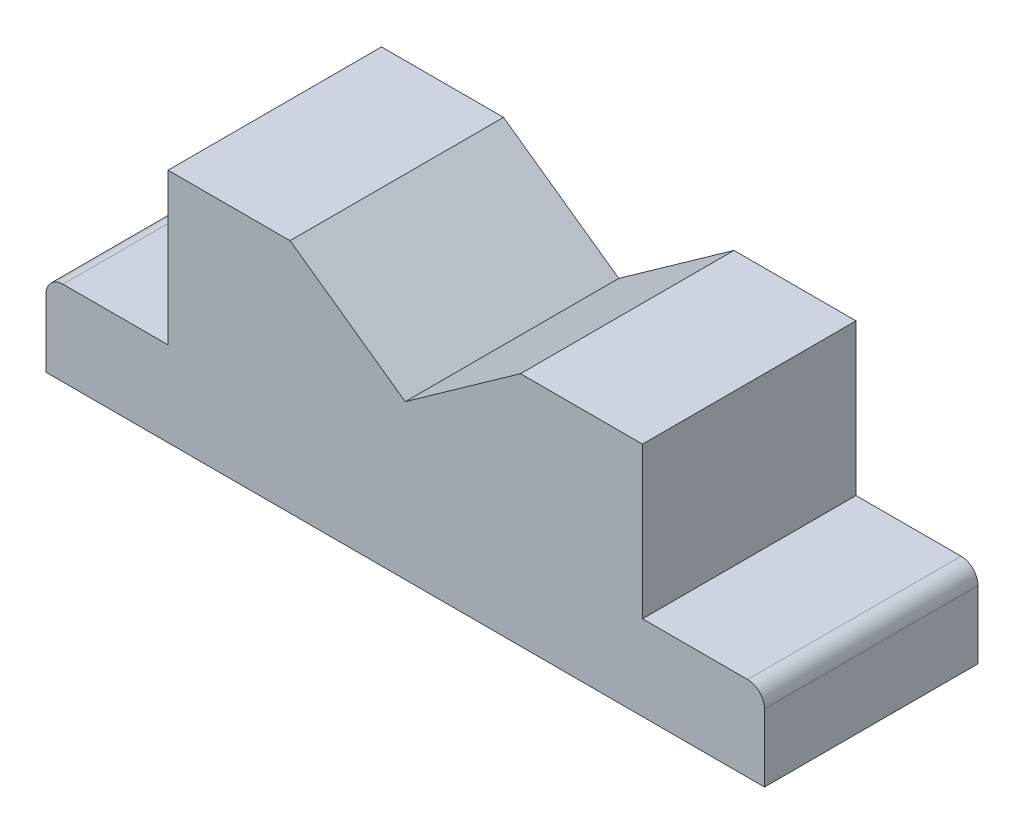
ISO-10303-21;
HEADER;
FILE_DESCRIPTION(('STEP AP214'),'2;1');
FILE_NAME('part.step','',(''),(''),'','','');
FILE_SCHEMA(('AUTOMOTIVE_DESIGN { 1 0 10303 214 1 1 1 1 }'));
ENDSEC;
DATA;
#1=APPLICATION_CONTEXT('core data for automotive mechanical design processes');
#2=APPLICATION_PROTOCOL_DEFINITION('international standard','automotive_design',2000,#1);
#3=PRODUCT_CONTEXT('',#1,'mechanical');
#4=PRODUCT('Part','Part','',(#3));
#5=PRODUCT_RELATED_PRODUCT_CATEGORY('part','',(#4));
#6=PRODUCT_DEFINITION_FORMATION('','',#4);
#7=PRODUCT_DEFINITION_CONTEXT('part definition',#1,'design');
#8=PRODUCT_DEFINITION('design','',#6,#7);
#9=PRODUCT_DEFINITION_SHAPE('','',#8);
#10=(LENGTH_UNIT() NAMED_UNIT(*) SI_UNIT(.MILLI.,.METRE.));
#11=(NAMED_UNIT(*) PLANE_ANGLE_UNIT() SI_UNIT($,.RADIAN.));
#12=(NAMED_UNIT(*) SI_UNIT($,.STERADIAN.) SOLID_ANGLE_UNIT());
#13=UNCERTAINTY_MEASURE_WITH_UNIT(LENGTH_MEASURE(1.E-05),#10,'distance_accuracy_value','');
#14=(GEOMETRIC_REPRESENTATION_CONTEXT(3) GLOBAL_UNCERTAINTY_ASSIGNED_CONTEXT((#13)) GLOBAL_UNIT_ASSIGNED_CONTEXT((#10,
#11,#12)) REPRESENTATION_CONTEXT('',''));
#15=CARTESIAN_POINT('',(0.,0.,0.));
#16=DIRECTION('',(0.,0.,1.));
#17=DIRECTION('',(1.,0.,0.));
#18=AXIS2_PLACEMENT_3D('',#15,#16,#17);
#19=CARTESIAN_POINT('',(0.,0.,63.));
#20=DIRECTION('',(1.,0.,0.));
#21=DIRECTION('',(0.,0.,-1.));
#22=AXIS2_PLACEMENT_3D('',#19,#20,#21);
#23=PLANE('',#22);
#24=DIRECTION('',(0.,-1.,0.));
#25=VECTOR('',#24,1.);
#26=CARTESIAN_POINT('',(0.,0.,63.));
#27=LINE('',#26,#25);
#28=CARTESIAN_POINT('',(0.,20.,63.));
#29=VERTEX_POINT('',#28);
#30=CARTESIAN_POINT('',(0.,0.,63.));
#31=VERTEX_POINT('',#30);
#32=EDGE_CURVE('E127',#29,#31,#27,.T.);
#33=ORIENTED_EDGE('',*,*,#32,.F.);
#34=DIRECTION('',(0.,0.,-1.));
#35=VECTOR('',#34,1.);
#36=CARTESIAN_POINT('',(0.,20.,63.));
#37=LINE('',#36,#35);
#38=CARTESIAN_POINT('',(0.,20.,0.));
#39=VERTEX_POINT('',#38);
#40=EDGE_CURVE('E165',#29,#39,#37,.T.);
#41=ORIENTED_EDGE('',*,*,#40,.T.);
#42=DIRECTION('',(0.,-1.,0.));
#43=VECTOR('',#42,1.);
#44=CARTESIAN_POINT('',(0.,0.,0.));
#45=LINE('',#44,#43);
#46=CARTESIAN_POINT('',(0.,0.,0.));
#47=VERTEX_POINT('',#46);
#48=EDGE_CURVE('E149',#39,#47,#45,.T.);
#49=ORIENTED_EDGE('',*,*,#48,.T.);
#50=DIRECTION('',(0.,0.,-1.));
#51=VECTOR('',#50,1.);
#52=CARTESIAN_POINT('',(0.,0.,63.));
#53=LINE('',#52,#51);
#54=EDGE_CURVE('E143',#31,#47,#53,.T.);
#55=ORIENTED_EDGE('',*,*,#54,.F.);
#56=EDGE_LOOP('',(#33,#41,#49,#55));
#57=FACE_BOUND('',#56,.T.);
#58=ADVANCED_FACE('F33',(#57),#23,.F.);
#59=CARTESIAN_POINT('',(0.,0.,63.));
#60=DIRECTION('',(0.,1.,0.));
#61=DIRECTION('',(0.,0.,1.));
#62=AXIS2_PLACEMENT_3D('',#59,#60,#61);
#63=PLANE('',#62);
#64=DIRECTION('',(1.,0.,0.));
#65=VECTOR('',#64,1.);
#66=CARTESIAN_POINT('',(0.,0.,0.));
#67=LINE('',#66,#65);
#68=CARTESIAN_POINT('',(212.,0.,0.));
#69=VERTEX_POINT('',#68);
#70=EDGE_CURVE('E170',#47,#69,#67,.T.);
#71=ORIENTED_EDGE('',*,*,#70,.T.);
#72=DIRECTION('',(0.,0.,-1.));
#73=VECTOR('',#72,1.);
#74=CARTESIAN_POINT('',(212.,0.,63.));
#75=LINE('',#74,#73);
#76=CARTESIAN_POINT('',(212.,0.,63.));
#77=VERTEX_POINT('',#76);
#78=EDGE_CURVE('E145',#77,#69,#75,.T.);
#79=ORIENTED_EDGE('',*,*,#78,.F.);
#80=DIRECTION('',(1.,0.,0.));
#81=VECTOR('',#80,1.);
#82=CARTESIAN_POINT('',(0.,0.,63.));
#83=LINE('',#82,#81);
#84=EDGE_CURVE('E131',#31,#77,#83,.T.);
#85=ORIENTED_EDGE('',*,*,#84,.F.);
#86=ORIENTED_EDGE('',*,*,#54,.T.);
#87=EDGE_LOOP('',(#71,#79,#85,#86));
#88=FACE_BOUND('',#87,.T.);
#89=ADVANCED_FACE('F142',(#88),#63,.F.);
#90=CARTESIAN_POINT('',(212.,0.,63.));
#91=DIRECTION('',(-1.,0.,0.));
#92=DIRECTION('',(0.,0.,1.));
#93=AXIS2_PLACEMENT_3D('',#90,#91,#92);
#94=PLANE('',#93);
#95=DIRECTION('',(0.,1.,0.));
#96=VECTOR('',#95,1.);
#97=CARTESIAN_POINT('',(212.,0.,0.));
#98=LINE('',#97,#96);
#99=CARTESIAN_POINT('',(212.,19.9999999999994,0.));
#100=VERTEX_POINT('',#99);
#101=EDGE_CURVE('E172',#69,#100,#98,.T.);
#102=ORIENTED_EDGE('',*,*,#101,.T.);
#103=DIRECTION('',(0.,0.,-1.));
#104=VECTOR('',#103,1.);
#105=CARTESIAN_POINT('',(212.,19.9999999999994,63.));
#106=LINE('',#105,#104);
#107=CARTESIAN_POINT('',(212.,19.9999999999994,63.));
#108=VERTEX_POINT('',#107);
#109=EDGE_CURVE('E161',#100,#108,#106,.F.);
#110=ORIENTED_EDGE('',*,*,#109,.T.);
#111=DIRECTION('',(0.,1.,0.));
#112=VECTOR('',#111,1.);
#113=CARTESIAN_POINT('',(212.,0.,63.));
#114=LINE('',#113,#112);
#115=EDGE_CURVE('E147',#77,#108,#114,.T.);
#116=ORIENTED_EDGE('',*,*,#115,.F.);
#117=ORIENTED_EDGE('',*,*,#78,.T.);
#118=EDGE_LOOP('',(#102,#110,#116,#117));
#119=FACE_BOUND('',#118,.T.);
#120=ADVANCED_FACE('F258',(#119),#94,.F.);
#121=CARTESIAN_POINT('',(212.,24.9999999999994,63.));
#122=DIRECTION('',(0.,-1.,0.));
#123=DIRECTION('',(1.,0.,0.));
#124=AXIS2_PLACEMENT_3D('',#121,#122,#123);
#125=PLANE('',#124);
#126=DIRECTION('',(-1.,0.,0.));
#127=VECTOR('',#126,1.);
#128=CARTESIAN_POINT('',(212.,24.9999999999994,63.));
#129=LINE('',#128,#127);
#130=CARTESIAN_POINT('',(207.,24.9999999999994,63.));
#131=VERTEX_POINT('',#130);
#132=CARTESIAN_POINT('',(176.,24.9999999999994,63.));
#133=VERTEX_POINT('',#132);
#134=EDGE_CURVE('E382',#131,#133,#129,.T.);
#135=ORIENTED_EDGE('',*,*,#134,.F.);
#136=DIRECTION('',(0.,0.,-1.));
#137=VECTOR('',#136,1.);
#138=CARTESIAN_POINT('',(207.,24.9999999999994,63.));
#139=LINE('',#138,#137);
#140=CARTESIAN_POINT('',(207.,24.9999999999994,0.));
#141=VERTEX_POINT('',#140);
#142=EDGE_CURVE('E151',#131,#141,#139,.T.);
#143=ORIENTED_EDGE('',*,*,#142,.T.);
#144=DIRECTION('',(-1.,0.,0.));
#145=VECTOR('',#144,1.);
#146=CARTESIAN_POINT('',(212.,24.9999999999994,0.));
#147=LINE('',#146,#145);
#148=CARTESIAN_POINT('',(176.,24.9999999999994,0.));
#149=VERTEX_POINT('',#148);
#150=EDGE_CURVE('E180',#141,#149,#147,.T.);
#151=ORIENTED_EDGE('',*,*,#150,.T.);
#152=DIRECTION('',(0.,0.,-1.));
#153=VECTOR('',#152,1.);
#154=CARTESIAN_POINT('',(176.,24.9999999999994,63.));
#155=LINE('',#154,#153);
#156=EDGE_CURVE('E156',#133,#149,#155,.T.);
#157=ORIENTED_EDGE('',*,*,#156,.F.);
#158=EDGE_LOOP('',(#135,#143,#151,#157));
#159=FACE_BOUND('',#158,.T.);
#160=ADVANCED_FACE('F263',(#159),#125,.F.);
#161=CARTESIAN_POINT('',(176.,24.9999999999994,63.));
#162=DIRECTION('',(-1.,0.,0.));
#163=DIRECTION('',(0.,0.,1.));
#164=AXIS2_PLACEMENT_3D('',#161,#162,#163);
#165=PLANE('',#164);
#166=DIRECTION('',(0.,1.,0.));
#167=VECTOR('',#166,1.);
#168=CARTESIAN_POINT('',(176.,24.9999999999994,0.));
#169=LINE('',#168,#167);
#170=CARTESIAN_POINT('',(176.,69.6325336437438,0.));
#171=VERTEX_POINT('',#170);
#172=EDGE_CURVE('E182',#149,#171,#169,.T.);
#173=ORIENTED_EDGE('',*,*,#172,.T.);
#174=DIRECTION('',(0.,0.,-1.));
#175=VECTOR('',#174,1.);
#176=CARTESIAN_POINT('',(176.,69.6325336437438,63.));
#177=LINE('',#176,#175);
#178=CARTESIAN_POINT('',(176.,69.6325336437438,63.));
#179=VERTEX_POINT('',#178);
#180=EDGE_CURVE('E210',#179,#171,#177,.T.);
#181=ORIENTED_EDGE('',*,*,#180,.F.);
#182=DIRECTION('',(0.,1.,0.));
#183=VECTOR('',#182,1.);
#184=CARTESIAN_POINT('',(176.,24.9999999999994,63.));
#185=LINE('',#184,#183);
#186=EDGE_CURVE('E219',#133,#179,#185,.T.);
#187=ORIENTED_EDGE('',*,*,#186,.F.);
#188=ORIENTED_EDGE('',*,*,#156,.T.);
#189=EDGE_LOOP('',(#173,#181,#187,#188));
#190=FACE_BOUND('',#189,.T.);
#191=ADVANCED_FACE('F217',(#190),#165,.F.);
#192=CARTESIAN_POINT('',(176.,69.6325336437438,63.));
#193=DIRECTION('',(0.,-1.,0.));
#194=DIRECTION('',(1.,0.,0.));
#195=AXIS2_PLACEMENT_3D('',#192,#193,#194);
#196=PLANE('',#195);
#197=DIRECTION('',(-1.,0.,0.));
#198=VECTOR('',#197,1.);
#199=CARTESIAN_POINT('',(176.,69.6325336437438,0.));
#200=LINE('',#199,#198);
#201=CARTESIAN_POINT('',(140.,69.6325336437438,0.));
#202=VERTEX_POINT('',#201);
#203=EDGE_CURVE('E184',#171,#202,#200,.T.);
#204=ORIENTED_EDGE('',*,*,#203,.T.);
#205=DIRECTION('',(0.,0.,-1.));
#206=VECTOR('',#205,1.);
#207=CARTESIAN_POINT('',(140.,69.6325336437438,63.));
#208=LINE('',#207,#206);
#209=CARTESIAN_POINT('',(140.,69.6325336437438,63.));
#210=VERTEX_POINT('',#209);
#211=EDGE_CURVE('E207',#210,#202,#208,.T.);
#212=ORIENTED_EDGE('',*,*,#211,.F.);
#213=DIRECTION('',(-1.,0.,0.));
#214=VECTOR('',#213,1.);
#215=CARTESIAN_POINT('',(176.,69.6325336437438,63.));
#216=LINE('',#215,#214);
#217=EDGE_CURVE('E237',#179,#210,#216,.T.);
#218=ORIENTED_EDGE('',*,*,#217,.F.);
#219=ORIENTED_EDGE('',*,*,#180,.T.);
#220=EDGE_LOOP('',(#204,#212,#218,#219));
#221=FACE_BOUND('',#220,.T.);
#222=ADVANCED_FACE('F228',(#221),#196,.F.);
#223=CARTESIAN_POINT('',(106.004578334285,45.4853277785118,63.));
#224=DIRECTION('',(0.579088626731626,-0.815264596551377,0.));
#225=DIRECTION('',(0.815264596551377,0.579088626731626,0.));
#226=AXIS2_PLACEMENT_3D('',#223,#224,#225);
#227=PLANE('',#226);
#228=DIRECTION('',(-0.815264596551377,-0.579088626731626,0.));
#229=VECTOR('',#228,1.);
#230=CARTESIAN_POINT('',(106.004578334285,45.4853277785118,0.));
#231=LINE('',#230,#229);
#232=CARTESIAN_POINT('',(106.004578334285,45.4853277785118,0.));
#233=VERTEX_POINT('',#232);
#234=EDGE_CURVE('E186',#202,#233,#231,.T.);
#235=ORIENTED_EDGE('',*,*,#234,.T.);
#236=DIRECTION('',(0.,0.,-1.));
#237=VECTOR('',#236,1.);
#238=CARTESIAN_POINT('',(106.004578334285,45.4853277785118,63.));
#239=LINE('',#238,#237);
#240=CARTESIAN_POINT('',(106.004578334285,45.4853277785118,63.));
#241=VERTEX_POINT('',#240);
#242=EDGE_CURVE('E204',#241,#233,#239,.T.);
#243=ORIENTED_EDGE('',*,*,#242,.F.);
#244=DIRECTION('',(-0.815264596551377,-0.579088626731626,0.));
#245=VECTOR('',#244,1.);
#246=CARTESIAN_POINT('',(106.004578334285,45.4853277785118,63.));
#247=LINE('',#246,#245);
#248=EDGE_CURVE('E234',#210,#241,#247,.T.);
#249=ORIENTED_EDGE('',*,*,#248,.F.);
#250=ORIENTED_EDGE('',*,*,#211,.T.);
#251=EDGE_LOOP('',(#235,#243,#249,#250));
#252=FACE_BOUND('',#251,.T.);
#253=ADVANCED_FACE('F232',(#252),#227,.F.);
#254=CARTESIAN_POINT('',(72.0045783342851,69.6325336437443,63.));
#255=DIRECTION('',(-0.579036794465032,-0.815301410924611,0.));
#256=DIRECTION('',(0.815301410924611,-0.579036794465032,0.));
#257=AXIS2_PLACEMENT_3D('',#254,#255,#256);
#258=PLANE('',#257);
#259=DIRECTION('',(-0.81530141092461,0.579036794465032,0.));
#260=VECTOR('',#259,1.);
#261=CARTESIAN_POINT('',(72.0045783342851,69.6325336437443,0.));
#262=LINE('',#261,#260);
#263=CARTESIAN_POINT('',(72.0045783342851,69.6325336437443,0.));
#264=VERTEX_POINT('',#263);
#265=EDGE_CURVE('E188',#233,#264,#262,.T.);
#266=ORIENTED_EDGE('',*,*,#265,.T.);
#267=DIRECTION('',(0.,0.,-1.));
#268=VECTOR('',#267,1.);
#269=CARTESIAN_POINT('',(72.0045783342851,69.6325336437443,63.));
#270=LINE('',#269,#268);
#271=CARTESIAN_POINT('',(72.0045783342851,69.6325336437443,63.));
#272=VERTEX_POINT('',#271);
#273=EDGE_CURVE('E201',#272,#264,#270,.T.);
#274=ORIENTED_EDGE('',*,*,#273,.F.);
#275=DIRECTION('',(-0.81530141092461,0.579036794465032,0.));
#276=VECTOR('',#275,1.);
#277=CARTESIAN_POINT('',(72.0045783342851,69.6325336437443,63.));
#278=LINE('',#277,#276);
#279=EDGE_CURVE('E236',#241,#272,#278,.T.);
#280=ORIENTED_EDGE('',*,*,#279,.F.);
#281=ORIENTED_EDGE('',*,*,#242,.T.);
#282=EDGE_LOOP('',(#266,#274,#280,#281));
#283=FACE_BOUND('',#282,.T.);
#284=ADVANCED_FACE('F273',(#283),#258,.F.);
#285=CARTESIAN_POINT('',(36.0045783342851,69.6325336437443,63.));
#286=DIRECTION('',(0.,-1.,0.));
#287=DIRECTION('',(0.,0.,-1.));
#288=AXIS2_PLACEMENT_3D('',#285,#286,#287);
#289=PLANE('',#288);
#290=DIRECTION('',(-1.,0.,0.));
#291=VECTOR('',#290,1.);
#292=CARTESIAN_POINT('',(36.0045783342851,69.6325336437443,0.));
#293=LINE('',#292,#291);
#294=CARTESIAN_POINT('',(36.0045783342851,69.6325336437443,0.));
#295=VERTEX_POINT('',#294);
#296=EDGE_CURVE('E190',#264,#295,#293,.T.);
#297=ORIENTED_EDGE('',*,*,#296,.T.);
#298=DIRECTION('',(0.,0.,-1.));
#299=VECTOR('',#298,1.);
#300=CARTESIAN_POINT('',(36.0045783342851,69.6325336437443,63.));
#301=LINE('',#300,#299);
#302=CARTESIAN_POINT('',(36.0045783342851,69.6325336437443,63.));
#303=VERTEX_POINT('',#302);
#304=EDGE_CURVE('E198',#303,#295,#301,.T.);
#305=ORIENTED_EDGE('',*,*,#304,.F.);
#306=DIRECTION('',(-1.,0.,0.));
#307=VECTOR('',#306,1.);
#308=CARTESIAN_POINT('',(36.0045783342851,69.6325336437443,63.));
#309=LINE('',#308,#307);
#310=EDGE_CURVE('E239',#272,#303,#309,.T.);
#311=ORIENTED_EDGE('',*,*,#310,.F.);
#312=ORIENTED_EDGE('',*,*,#273,.T.);
#313=EDGE_LOOP('',(#297,#305,#311,#312));
#314=FACE_BOUND('',#313,.T.);
#315=ADVANCED_FACE('F276',(#314),#289,.F.);
#316=CARTESIAN_POINT('',(36.0045783342851,25.,63.));
#317=DIRECTION('',(1.,0.,0.));
#318=DIRECTION('',(0.,0.,-1.));
#319=AXIS2_PLACEMENT_3D('',#316,#317,#318);
#320=PLANE('',#319);
#321=DIRECTION('',(0.,-1.,0.));
#322=VECTOR('',#321,1.);
#323=CARTESIAN_POINT('',(36.0045783342851,25.,0.));
#324=LINE('',#323,#322);
#325=CARTESIAN_POINT('',(36.0045783342851,25.,0.));
#326=VERTEX_POINT('',#325);
#327=EDGE_CURVE('E192',#295,#326,#324,.T.);
#328=ORIENTED_EDGE('',*,*,#327,.T.);
#329=DIRECTION('',(0.,0.,-1.));
#330=VECTOR('',#329,1.);
#331=CARTESIAN_POINT('',(36.0045783342851,25.,63.));
#332=LINE('',#331,#330);
#333=CARTESIAN_POINT('',(36.0045783342851,25.,63.));
#334=VERTEX_POINT('',#333);
#335=EDGE_CURVE('E195',#334,#326,#332,.T.);
#336=ORIENTED_EDGE('',*,*,#335,.F.);
#337=DIRECTION('',(0.,-1.,0.));
#338=VECTOR('',#337,1.);
#339=CARTESIAN_POINT('',(36.0045783342851,25.,63.));
#340=LINE('',#339,#338);
#341=EDGE_CURVE('E244',#303,#334,#340,.T.);
#342=ORIENTED_EDGE('',*,*,#341,.F.);
#343=ORIENTED_EDGE('',*,*,#304,.T.);
#344=EDGE_LOOP('',(#328,#336,#342,#343));
#345=FACE_BOUND('',#344,.T.);
#346=ADVANCED_FACE('F280',(#345),#320,.F.);
#347=CARTESIAN_POINT('',(0.,25.,63.));
#348=DIRECTION('',(0.,-1.,0.));
#349=DIRECTION('',(0.,0.,-1.));
#350=AXIS2_PLACEMENT_3D('',#347,#348,#349);
#351=PLANE('',#350);
#352=DIRECTION('',(-1.,0.,0.));
#353=VECTOR('',#352,1.);
#354=CARTESIAN_POINT('',(0.,25.,0.));
#355=LINE('',#354,#353);
#356=CARTESIAN_POINT('',(5.,25.,0.));
#357=VERTEX_POINT('',#356);
#358=EDGE_CURVE('E138',#326,#357,#355,.T.);
#359=ORIENTED_EDGE('',*,*,#358,.T.);
#360=DIRECTION('',(0.,0.,-1.));
#361=VECTOR('',#360,1.);
#362=CARTESIAN_POINT('',(5.,25.,63.));
#363=LINE('',#362,#361);
#364=CARTESIAN_POINT('',(5.,25.,63.));
#365=VERTEX_POINT('',#364);
#366=EDGE_CURVE('E41',#357,#365,#363,.F.);
#367=ORIENTED_EDGE('',*,*,#366,.T.);
#368=DIRECTION('',(-1.,0.,0.));
#369=VECTOR('',#368,1.);
#370=CARTESIAN_POINT('',(0.,25.,63.));
#371=LINE('',#370,#369);
#372=EDGE_CURVE('E175',#334,#365,#371,.T.);
#373=ORIENTED_EDGE('',*,*,#372,.F.);
#374=ORIENTED_EDGE('',*,*,#335,.T.);
#375=EDGE_LOOP('',(#359,#367,#373,#374));
#376=FACE_BOUND('',#375,.T.);
#377=ADVANCED_FACE('F284',(#376),#351,.F.);
#378=CARTESIAN_POINT('',(0.,0.,63.));
#379=DIRECTION('',(0.,0.,-1.));
#380=DIRECTION('',(-1.,0.,0.));
#381=AXIS2_PLACEMENT_3D('',#378,#379,#380);
#382=PLANE('',#381);
#383=ORIENTED_EDGE('',*,*,#372,.T.);
#384=CARTESIAN_POINT('',(5.,20.,63.));
#385=DIRECTION('',(0.,0.,-1.));
#386=DIRECTION('',(-1.,0.,0.));
#387=AXIS2_PLACEMENT_3D('',#384,#385,#386);
#388=CIRCLE('',#387,5.);
#389=EDGE_CURVE('E11',#365,#29,#388,.F.);
#390=ORIENTED_EDGE('',*,*,#389,.T.);
#391=ORIENTED_EDGE('',*,*,#32,.T.);
#392=ORIENTED_EDGE('',*,*,#84,.T.);
#393=ORIENTED_EDGE('',*,*,#115,.T.);
#394=CARTESIAN_POINT('',(207.,19.9999999999994,63.));
#395=DIRECTION('',(0.,0.,-1.));
#396=DIRECTION('',(-1.,0.,0.));
#397=AXIS2_PLACEMENT_3D('',#394,#395,#396);
#398=CIRCLE('',#397,5.);
#399=EDGE_CURVE('E163',#108,#131,#398,.F.);
#400=ORIENTED_EDGE('',*,*,#399,.T.);
#401=ORIENTED_EDGE('',*,*,#134,.T.);
#402=ORIENTED_EDGE('',*,*,#186,.T.);
#403=ORIENTED_EDGE('',*,*,#217,.T.);
#404=ORIENTED_EDGE('',*,*,#248,.T.);
#405=ORIENTED_EDGE('',*,*,#279,.T.);
#406=ORIENTED_EDGE('',*,*,#310,.T.);
#407=ORIENTED_EDGE('',*,*,#341,.T.);
#408=EDGE_LOOP('',(#383,#390,#391,#392,#393,#400,#401,#402,#403,#404,#405,#406,#407));
#409=FACE_BOUND('',#408,.T.);
#410=ADVANCED_FACE('F129',(#409),#382,.F.);
#411=CARTESIAN_POINT('',(0.,0.,0.));
#412=DIRECTION('',(0.,0.,-1.));
#413=DIRECTION('',(-1.,0.,0.));
#414=AXIS2_PLACEMENT_3D('',#411,#412,#413);
#415=PLANE('',#414);
#416=ORIENTED_EDGE('',*,*,#48,.F.);
#417=CARTESIAN_POINT('',(5.,20.,0.));
#418=DIRECTION('',(0.,0.,-1.));
#419=DIRECTION('',(-1.,0.,0.));
#420=AXIS2_PLACEMENT_3D('',#417,#418,#419);
#421=CIRCLE('',#420,5.);
#422=EDGE_CURVE('E55',#39,#357,#421,.T.);
#423=ORIENTED_EDGE('',*,*,#422,.T.);
#424=ORIENTED_EDGE('',*,*,#358,.F.);
#425=ORIENTED_EDGE('',*,*,#327,.F.);
#426=ORIENTED_EDGE('',*,*,#296,.F.);
#427=ORIENTED_EDGE('',*,*,#265,.F.);
#428=ORIENTED_EDGE('',*,*,#234,.F.);
#429=ORIENTED_EDGE('',*,*,#203,.F.);
#430=ORIENTED_EDGE('',*,*,#172,.F.);
#431=ORIENTED_EDGE('',*,*,#150,.F.);
#432=CARTESIAN_POINT('',(207.,19.9999999999994,0.));
#433=DIRECTION('',(0.,0.,-1.));
#434=DIRECTION('',(-1.,0.,0.));
#435=AXIS2_PLACEMENT_3D('',#432,#433,#434);
#436=CIRCLE('',#435,5.);
#437=EDGE_CURVE('E154',#141,#100,#436,.T.);
#438=ORIENTED_EDGE('',*,*,#437,.T.);
#439=ORIENTED_EDGE('',*,*,#101,.F.);
#440=ORIENTED_EDGE('',*,*,#70,.F.);
#441=EDGE_LOOP('',(#416,#423,#424,#425,#426,#427,#428,#429,#430,#431,#438,#439,#440));
#442=FACE_BOUND('',#441,.T.);
#443=ADVANCED_FACE('F168',(#442),#415,.T.);
#444=CARTESIAN_POINT('',(207.,19.9999999999994,63.));
#445=DIRECTION('',(0.,0.,-1.));
#446=DIRECTION('',(-1.,0.,0.));
#447=AXIS2_PLACEMENT_3D('',#444,#445,#446);
#448=CYLINDRICAL_SURFACE('',#447,5.);
#449=ORIENTED_EDGE('',*,*,#399,.F.);
#450=ORIENTED_EDGE('',*,*,#109,.F.);
#451=ORIENTED_EDGE('',*,*,#437,.F.);
#452=ORIENTED_EDGE('',*,*,#142,.F.);
#453=EDGE_LOOP('',(#449,#450,#451,#452));
#454=FACE_BOUND('',#453,.T.);
#455=ADVANCED_FACE('F248',(#454),#448,.T.);
#456=CARTESIAN_POINT('',(5.,20.,63.));
#457=DIRECTION('',(0.,0.,-1.));
#458=DIRECTION('',(-1.,0.,0.));
#459=AXIS2_PLACEMENT_3D('',#456,#457,#458);
#460=CYLINDRICAL_SURFACE('',#459,5.);
#461=ORIENTED_EDGE('',*,*,#389,.F.);
#462=ORIENTED_EDGE('',*,*,#366,.F.);
#463=ORIENTED_EDGE('',*,*,#422,.F.);
#464=ORIENTED_EDGE('',*,*,#40,.F.);
#465=EDGE_LOOP('',(#461,#462,#463,#464));
#466=FACE_BOUND('',#465,.T.);
#467=ADVANCED_FACE('F35',(#466),#460,.T.);
#468=CLOSED_SHELL('',(#58,#89,#120,#160,#191,#222,#253,#284,#315,#346,#377,#410,#443,#455,#467));
#469=MANIFOLD_SOLID_BREP('B2',#468);
#470=ADVANCED_BREP_SHAPE_REPRESENTATION('',(#18,#469),#14);
#471=SHAPE_DEFINITION_REPRESENTATION(#9,#470);
ENDSEC;
END-ISO-10303-21;
